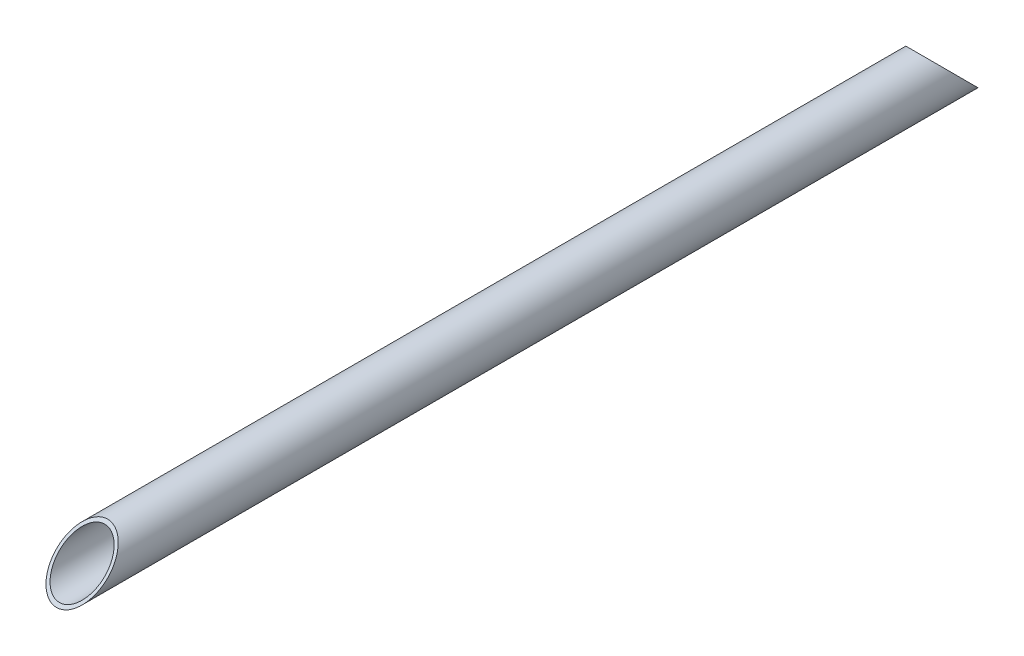
ISO-10303-21;
HEADER;
FILE_DESCRIPTION(('STEP AP214'),'2;1');
FILE_NAME('part.step','',(''),(''),'','','');
FILE_SCHEMA(('AUTOMOTIVE_DESIGN { 1 0 10303 214 1 1 1 1 }'));
ENDSEC;
DATA;
#1=APPLICATION_CONTEXT('core data for automotive mechanical design processes');
#2=APPLICATION_PROTOCOL_DEFINITION('international standard','automotive_design',2000,#1);
#3=PRODUCT_CONTEXT('',#1,'mechanical');
#4=PRODUCT('Part','Part','',(#3));
#5=PRODUCT_RELATED_PRODUCT_CATEGORY('part','',(#4));
#6=PRODUCT_DEFINITION_FORMATION('','',#4);
#7=PRODUCT_DEFINITION_CONTEXT('part definition',#1,'design');
#8=PRODUCT_DEFINITION('design','',#6,#7);
#9=PRODUCT_DEFINITION_SHAPE('','',#8);
#10=(LENGTH_UNIT() NAMED_UNIT(*) SI_UNIT(.MILLI.,.METRE.));
#11=(NAMED_UNIT(*) PLANE_ANGLE_UNIT() SI_UNIT($,.RADIAN.));
#12=(NAMED_UNIT(*) SI_UNIT($,.STERADIAN.) SOLID_ANGLE_UNIT());
#13=UNCERTAINTY_MEASURE_WITH_UNIT(LENGTH_MEASURE(1.E-05),#10,'distance_accuracy_value','');
#14=(GEOMETRIC_REPRESENTATION_CONTEXT(3) GLOBAL_UNCERTAINTY_ASSIGNED_CONTEXT((#13)) GLOBAL_UNIT_ASSIGNED_CONTEXT((#10,
#11,#12)) REPRESENTATION_CONTEXT('',''));
#15=CARTESIAN_POINT('',(0.,0.,0.));
#16=DIRECTION('',(0.,0.,1.));
#17=DIRECTION('',(1.,0.,0.));
#18=AXIS2_PLACEMENT_3D('',#15,#16,#17);
#19=CARTESIAN_POINT('',(0.,0.,339.725));
#20=DIRECTION('',(0.,0.,-1.));
#21=DIRECTION('',(0.,-1.,0.));
#22=AXIS2_PLACEMENT_3D('',#19,#20,#21);
#23=CYLINDRICAL_SURFACE('',#22,16.891);
#24=CARTESIAN_POINT('',(0.,0.,320.675));
#25=DIRECTION('',(0.,-0.707106781186541,-0.707106781186554));
#26=DIRECTION('',(0.,0.707106781186554,-0.707106781186541));
#27=AXIS2_PLACEMENT_3D('',#24,#25,#26);
#28=ELLIPSE('',#27,23.8874812820438,16.891);
#29=CARTESIAN_POINT('',(0.,16.8910000000001,303.784000000001));
#30=VERTEX_POINT('',#29);
#31=EDGE_CURVE('E25',#30,#30,#28,.T.);
#32=ORIENTED_EDGE('',*,*,#31,.F.);
#33=EDGE_LOOP('',(#32));
#34=FACE_BOUND('',#33,.T.);
#35=CARTESIAN_POINT('',(0.,0.,-320.675));
#36=DIRECTION('',(0.,-0.707106781186539,0.707106781186556));
#37=DIRECTION('',(0.,-0.707106781186556,-0.707106781186539));
#38=AXIS2_PLACEMENT_3D('',#35,#36,#37);
#39=ELLIPSE('',#38,23.8874812820438,16.891);
#40=CARTESIAN_POINT('',(0.,-16.891,-337.566));
#41=VERTEX_POINT('',#40);
#42=EDGE_CURVE('E27',#41,#41,#39,.T.);
#43=ORIENTED_EDGE('',*,*,#42,.F.);
#44=EDGE_LOOP('',(#43));
#45=FACE_BOUND('',#44,.T.);
#46=ADVANCED_FACE('F14',(#34,#45),#23,.F.);
#47=CARTESIAN_POINT('',(0.,0.,339.725));
#48=DIRECTION('',(0.,0.,-1.));
#49=DIRECTION('',(0.,-1.,0.));
#50=AXIS2_PLACEMENT_3D('',#47,#48,#49);
#51=CYLINDRICAL_SURFACE('',#50,19.05);
#52=CARTESIAN_POINT('',(0.,0.,320.675));
#53=DIRECTION('',(0.,-0.707106781186541,-0.707106781186554));
#54=DIRECTION('',(0.,0.707106781186554,-0.707106781186541));
#55=AXIS2_PLACEMENT_3D('',#52,#53,#54);
#56=ELLIPSE('',#55,26.9407683632073,19.05);
#57=CARTESIAN_POINT('',(0.,19.05,301.625000000001));
#58=VERTEX_POINT('',#57);
#59=EDGE_CURVE('E9',#58,#58,#56,.T.);
#60=ORIENTED_EDGE('',*,*,#59,.T.);
#61=EDGE_LOOP('',(#60));
#62=FACE_BOUND('',#61,.T.);
#63=CARTESIAN_POINT('',(0.,0.,-320.675));
#64=DIRECTION('',(0.,-0.707106781186539,0.707106781186556));
#65=DIRECTION('',(0.,-0.707106781186556,-0.707106781186539));
#66=AXIS2_PLACEMENT_3D('',#63,#64,#65);
#67=ELLIPSE('',#66,26.940768363207,19.05);
#68=CARTESIAN_POINT('',(0.,-19.0499999999998,-339.725));
#69=VERTEX_POINT('',#68);
#70=EDGE_CURVE('E18',#69,#69,#67,.T.);
#71=ORIENTED_EDGE('',*,*,#70,.T.);
#72=EDGE_LOOP('',(#71));
#73=FACE_BOUND('',#72,.T.);
#74=ADVANCED_FACE('F16',(#62,#73),#51,.T.);
#75=CARTESIAN_POINT('',(-19.05,-19.05,339.725));
#76=DIRECTION('',(0.,-0.70710678118654,-0.707106781186555));
#77=DIRECTION('',(0.,0.707106781186555,-0.70710678118654));
#78=AXIS2_PLACEMENT_3D('',#75,#76,#77);
#79=PLANE('',#78);
#80=ORIENTED_EDGE('',*,*,#59,.F.);
#81=EDGE_LOOP('',(#80));
#82=FACE_BOUND('',#81,.T.);
#83=ORIENTED_EDGE('',*,*,#31,.T.);
#84=EDGE_LOOP('',(#83));
#85=FACE_BOUND('',#84,.T.);
#86=ADVANCED_FACE('F33',(#82,#85),#79,.F.);
#87=CARTESIAN_POINT('',(-19.05,-19.05,-339.725));
#88=DIRECTION('',(0.,-0.70710678118654,0.707106781186555));
#89=DIRECTION('',(0.,-0.707106781186555,-0.70710678118654));
#90=AXIS2_PLACEMENT_3D('',#87,#88,#89);
#91=PLANE('',#90);
#92=ORIENTED_EDGE('',*,*,#70,.F.);
#93=EDGE_LOOP('',(#92));
#94=FACE_BOUND('',#93,.T.);
#95=ORIENTED_EDGE('',*,*,#42,.T.);
#96=EDGE_LOOP('',(#95));
#97=FACE_BOUND('',#96,.T.);
#98=ADVANCED_FACE('F39',(#94,#97),#91,.F.);
#99=CLOSED_SHELL('',(#46,#74,#86,#98));
#100=MANIFOLD_SOLID_BREP('B1',#99);
#101=ADVANCED_BREP_SHAPE_REPRESENTATION('',(#18,#100),#14);
#102=SHAPE_DEFINITION_REPRESENTATION(#9,#101);
ENDSEC;
END-ISO-10303-21;
